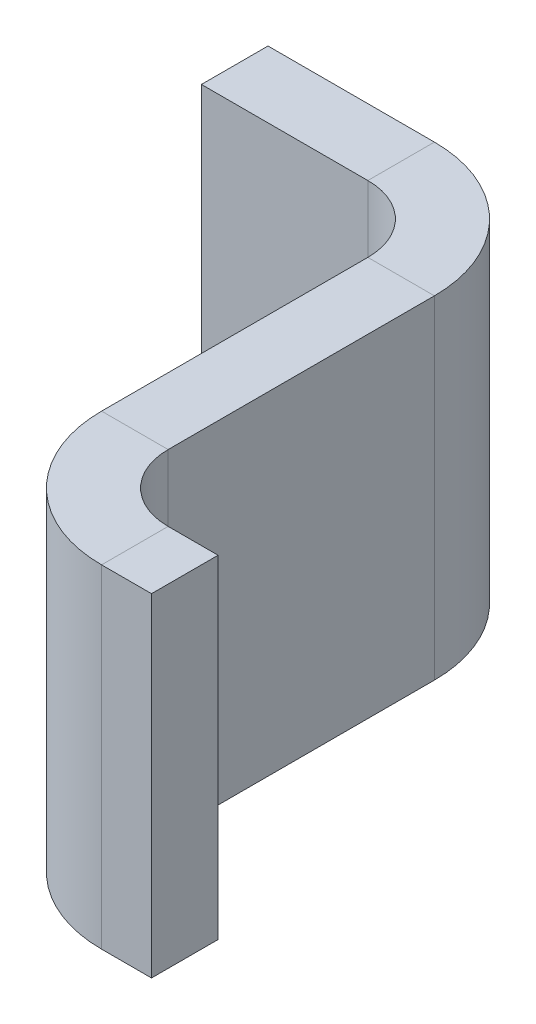
ISO-10303-21;
HEADER;
FILE_DESCRIPTION(('STEP AP214'),'2;1');
FILE_NAME('part.step','',(''),(''),'','','');
FILE_SCHEMA(('AUTOMOTIVE_DESIGN { 1 0 10303 214 1 1 1 1 }'));
ENDSEC;
DATA;
#1=APPLICATION_CONTEXT('core data for automotive mechanical design processes');
#2=APPLICATION_PROTOCOL_DEFINITION('international standard','automotive_design',2000,#1);
#3=PRODUCT_CONTEXT('',#1,'mechanical');
#4=PRODUCT('Part','Part','',(#3));
#5=PRODUCT_RELATED_PRODUCT_CATEGORY('part','',(#4));
#6=PRODUCT_DEFINITION_FORMATION('','',#4);
#7=PRODUCT_DEFINITION_CONTEXT('part definition',#1,'design');
#8=PRODUCT_DEFINITION('design','',#6,#7);
#9=PRODUCT_DEFINITION_SHAPE('','',#8);
#10=(LENGTH_UNIT() NAMED_UNIT(*) SI_UNIT(.MILLI.,.METRE.));
#11=(NAMED_UNIT(*) PLANE_ANGLE_UNIT() SI_UNIT($,.RADIAN.));
#12=(NAMED_UNIT(*) SI_UNIT($,.STERADIAN.) SOLID_ANGLE_UNIT());
#13=UNCERTAINTY_MEASURE_WITH_UNIT(LENGTH_MEASURE(1.E-05),#10,'distance_accuracy_value','');
#14=(GEOMETRIC_REPRESENTATION_CONTEXT(3) GLOBAL_UNCERTAINTY_ASSIGNED_CONTEXT((#13)) GLOBAL_UNIT_ASSIGNED_CONTEXT((#10,
#11,#12)) REPRESENTATION_CONTEXT('',''));
#15=CARTESIAN_POINT('',(0.,0.,0.));
#16=DIRECTION('',(0.,0.,1.));
#17=DIRECTION('',(1.,0.,0.));
#18=AXIS2_PLACEMENT_3D('',#15,#16,#17);
#19=CARTESIAN_POINT('',(125.54658584643,15.675655455272,0.));
#20=DIRECTION('',(1.,8.74227765734797E-08,0.));
#21=DIRECTION('',(0.,0.,-1.));
#22=AXIS2_PLACEMENT_3D('',#19,#20,#21);
#23=PLANE('',#22);
#24=DIRECTION('',(-8.74227765734797E-08,1.,0.));
#25=VECTOR('',#24,1.);
#26=CARTESIAN_POINT('',(125.54658584643,15.675655455272,0.));
#27=LINE('',#26,#25);
#28=CARTESIAN_POINT('',(125.54658589014,15.175655455272,0.));
#29=VERTEX_POINT('',#28);
#30=CARTESIAN_POINT('',(125.54658584643,15.675655455272,0.));
#31=VERTEX_POINT('',#30);
#32=EDGE_CURVE('E229',#29,#31,#27,.T.);
#33=ORIENTED_EDGE('',*,*,#32,.F.);
#34=DIRECTION('',(0.,0.,-1.));
#35=VECTOR('',#34,1.);
#36=CARTESIAN_POINT('',(125.54658589014,15.175655455272,0.));
#37=LINE('',#36,#35);
#38=CARTESIAN_POINT('',(125.54658589014,15.175655455272,0.1));
#39=VERTEX_POINT('',#38);
#40=EDGE_CURVE('E11',#39,#29,#37,.T.);
#41=ORIENTED_EDGE('',*,*,#40,.F.);
#42=DIRECTION('',(8.74227765734797E-08,-1.,0.));
#43=VECTOR('',#42,1.);
#44=CARTESIAN_POINT('',(125.54658589014,15.175655455272,0.1));
#45=LINE('',#44,#43);
#46=CARTESIAN_POINT('',(125.54658584643,15.675655455272,0.1));
#47=VERTEX_POINT('',#46);
#48=EDGE_CURVE('E132',#47,#39,#45,.T.);
#49=ORIENTED_EDGE('',*,*,#48,.F.);
#50=DIRECTION('',(0.,0.,1.));
#51=VECTOR('',#50,1.);
#52=CARTESIAN_POINT('',(125.54658584643,15.675655455272,0.1));
#53=LINE('',#52,#51);
#54=EDGE_CURVE('E224',#31,#47,#53,.T.);
#55=ORIENTED_EDGE('',*,*,#54,.F.);
#56=EDGE_LOOP('',(#33,#41,#49,#55));
#57=FACE_BOUND('',#56,.T.);
#58=ADVANCED_FACE('F16',(#57),#23,.F.);
#59=CARTESIAN_POINT('',(125.79658589014,15.175655477128,0.));
#60=DIRECTION('',(-8.74227765734797E-08,1.,0.));
#61=DIRECTION('',(0.,0.,1.));
#62=AXIS2_PLACEMENT_3D('',#59,#60,#61);
#63=PLANE('',#62);
#64=ORIENTED_EDGE('',*,*,#40,.T.);
#65=DIRECTION('',(-1.,-8.74227765734797E-08,0.));
#66=VECTOR('',#65,1.);
#67=CARTESIAN_POINT('',(125.79658589014,15.175655477128,0.));
#68=LINE('',#67,#66);
#69=CARTESIAN_POINT('',(125.79658589014,15.175655477128,0.));
#70=VERTEX_POINT('',#69);
#71=EDGE_CURVE('E210',#70,#29,#68,.T.);
#72=ORIENTED_EDGE('',*,*,#71,.F.);
#73=DIRECTION('',(0.,0.,-1.));
#74=VECTOR('',#73,1.);
#75=CARTESIAN_POINT('',(125.79658589014,15.175655477128,0.));
#76=LINE('',#75,#74);
#77=CARTESIAN_POINT('',(125.79658589014,15.175655477128,0.1));
#78=VERTEX_POINT('',#77);
#79=EDGE_CURVE('E27',#78,#70,#76,.T.);
#80=ORIENTED_EDGE('',*,*,#79,.F.);
#81=DIRECTION('',(-1.,-8.74227765734797E-08,0.));
#82=VECTOR('',#81,1.);
#83=CARTESIAN_POINT('',(125.79658589014,15.175655477128,0.1));
#84=LINE('',#83,#82);
#85=EDGE_CURVE('E169',#78,#39,#84,.T.);
#86=ORIENTED_EDGE('',*,*,#85,.T.);
#87=EDGE_LOOP('',(#64,#72,#80,#86));
#88=FACE_BOUND('',#87,.T.);
#89=ADVANCED_FACE('F292',(#88),#63,.F.);
#90=CARTESIAN_POINT('',(125.90265190732,15.1756554864,0.09393398282202));
#91=DIRECTION('',(8.74227765734797E-08,-1.,0.));
#92=DIRECTION('',(0.,0.,-1.));
#93=AXIS2_PLACEMENT_3D('',#90,#91,#92);
#94=PLANE('',#93);
#95=CARTESIAN_POINT('',(125.79658589014,15.175655477128,0.2));
#96=DIRECTION('',(-8.74227765734797E-08,1.,0.));
#97=DIRECTION('',(0.,0.,-1.));
#98=AXIS2_PLACEMENT_3D('',#95,#96,#97);
#99=CIRCLE('',#98,0.1);
#100=CARTESIAN_POINT('',(125.89658589014,15.17565548587,0.2));
#101=VERTEX_POINT('',#100);
#102=EDGE_CURVE('E111',#101,#78,#99,.T.);
#103=ORIENTED_EDGE('',*,*,#102,.T.);
#104=ORIENTED_EDGE('',*,*,#79,.T.);
#105=CARTESIAN_POINT('',(125.79658589014,15.175655477128,0.2));
#106=DIRECTION('',(-8.74227765734797E-08,1.,0.));
#107=DIRECTION('',(0.,0.,-1.));
#108=AXIS2_PLACEMENT_3D('',#105,#106,#107);
#109=CIRCLE('',#108,0.2);
#110=CARTESIAN_POINT('',(125.99658589014,15.175655494612,0.2));
#111=VERTEX_POINT('',#110);
#112=EDGE_CURVE('E114',#111,#70,#109,.T.);
#113=ORIENTED_EDGE('',*,*,#112,.F.);
#114=DIRECTION('',(1.,8.74227765734797E-08,0.));
#115=VECTOR('',#114,1.);
#116=CARTESIAN_POINT('',(125.99658589014,15.175655494612,0.2));
#117=LINE('',#116,#115);
#118=EDGE_CURVE('E108',#101,#111,#117,.T.);
#119=ORIENTED_EDGE('',*,*,#118,.F.);
#120=EDGE_LOOP('',(#103,#104,#113,#119));
#121=FACE_BOUND('',#120,.T.);
#122=ADVANCED_FACE('F110',(#121),#94,.T.);
#123=CARTESIAN_POINT('',(125.99658589014,15.175655494612,0.6));
#124=DIRECTION('',(-8.74227765734797E-08,1.,0.));
#125=DIRECTION('',(0.,0.,1.));
#126=AXIS2_PLACEMENT_3D('',#123,#124,#125);
#127=PLANE('',#126);
#128=ORIENTED_EDGE('',*,*,#118,.T.);
#129=DIRECTION('',(0.,0.,-1.));
#130=VECTOR('',#129,1.);
#131=CARTESIAN_POINT('',(125.99658589014,15.175655494612,0.6));
#132=LINE('',#131,#130);
#133=CARTESIAN_POINT('',(125.99658589014,15.175655494612,0.6));
#134=VERTEX_POINT('',#133);
#135=EDGE_CURVE('E156',#134,#111,#132,.T.);
#136=ORIENTED_EDGE('',*,*,#135,.F.);
#137=DIRECTION('',(1.,8.74227765734797E-08,0.));
#138=VECTOR('',#137,1.);
#139=CARTESIAN_POINT('',(125.99658589014,15.175655494612,0.6));
#140=LINE('',#139,#138);
#141=CARTESIAN_POINT('',(125.89658589014,15.17565548587,0.6));
#142=VERTEX_POINT('',#141);
#143=EDGE_CURVE('E120',#142,#134,#140,.T.);
#144=ORIENTED_EDGE('',*,*,#143,.F.);
#145=DIRECTION('',(0.,0.,-1.));
#146=VECTOR('',#145,1.);
#147=CARTESIAN_POINT('',(125.89658589014,15.17565548587,0.6));
#148=LINE('',#147,#146);
#149=EDGE_CURVE('E135',#142,#101,#148,.T.);
#150=ORIENTED_EDGE('',*,*,#149,.T.);
#151=EDGE_LOOP('',(#128,#136,#144,#150));
#152=FACE_BOUND('',#151,.T.);
#153=ADVANCED_FACE('F136',(#152),#127,.F.);
#154=CARTESIAN_POINT('',(125.99051987296,15.175655494082,0.706066017178));
#155=DIRECTION('',(8.74227765734797E-08,-1.,0.));
#156=DIRECTION('',(0.,0.,-1.));
#157=AXIS2_PLACEMENT_3D('',#154,#155,#156);
#158=PLANE('',#157);
#159=CARTESIAN_POINT('',(126.09658589014,15.175655503355,0.6));
#160=DIRECTION('',(8.74227765734797E-08,-1.,0.));
#161=DIRECTION('',(0.,0.,-1.));
#162=AXIS2_PLACEMENT_3D('',#159,#160,#161);
#163=CIRCLE('',#162,0.2);
#164=CARTESIAN_POINT('',(126.09658589014,15.175655503355,0.8));
#165=VERTEX_POINT('',#164);
#166=EDGE_CURVE('E147',#165,#142,#163,.T.);
#167=ORIENTED_EDGE('',*,*,#166,.T.);
#168=ORIENTED_EDGE('',*,*,#143,.T.);
#169=CARTESIAN_POINT('',(126.09658589014,15.175655503355,0.6));
#170=DIRECTION('',(8.74227765734797E-08,-1.,0.));
#171=DIRECTION('',(0.,0.,-1.));
#172=AXIS2_PLACEMENT_3D('',#169,#170,#171);
#173=CIRCLE('',#172,0.1);
#174=CARTESIAN_POINT('',(126.09658589014,15.175655503355,0.7));
#175=VERTEX_POINT('',#174);
#176=EDGE_CURVE('E206',#175,#134,#173,.T.);
#177=ORIENTED_EDGE('',*,*,#176,.F.);
#178=DIRECTION('',(0.,0.,-1.));
#179=VECTOR('',#178,1.);
#180=CARTESIAN_POINT('',(126.09658589014,15.175655503355,0.7));
#181=LINE('',#180,#179);
#182=EDGE_CURVE('E166',#165,#175,#181,.T.);
#183=ORIENTED_EDGE('',*,*,#182,.F.);
#184=EDGE_LOOP('',(#167,#168,#177,#183));
#185=FACE_BOUND('',#184,.T.);
#186=ADVANCED_FACE('F310',(#185),#158,.T.);
#187=CARTESIAN_POINT('',(126.17158589014,15.175655509911,0.7));
#188=DIRECTION('',(-8.74227765734797E-08,1.,0.));
#189=DIRECTION('',(0.,0.,1.));
#190=AXIS2_PLACEMENT_3D('',#187,#188,#189);
#191=PLANE('',#190);
#192=ORIENTED_EDGE('',*,*,#182,.T.);
#193=DIRECTION('',(-1.,-8.74227765734797E-08,0.));
#194=VECTOR('',#193,1.);
#195=CARTESIAN_POINT('',(126.17158589014,15.175655509911,0.7));
#196=LINE('',#195,#194);
#197=CARTESIAN_POINT('',(126.17158589014,15.175655509911,0.7));
#198=VERTEX_POINT('',#197);
#199=EDGE_CURVE('E187',#198,#175,#196,.T.);
#200=ORIENTED_EDGE('',*,*,#199,.F.);
#201=DIRECTION('',(0.,0.,-1.));
#202=VECTOR('',#201,1.);
#203=CARTESIAN_POINT('',(126.17158589014,15.175655509911,0.7));
#204=LINE('',#203,#202);
#205=CARTESIAN_POINT('',(126.17158589014,15.175655509911,0.8));
#206=VERTEX_POINT('',#205);
#207=EDGE_CURVE('E175',#206,#198,#204,.T.);
#208=ORIENTED_EDGE('',*,*,#207,.F.);
#209=DIRECTION('',(-1.,-8.74227765734797E-08,0.));
#210=VECTOR('',#209,1.);
#211=CARTESIAN_POINT('',(126.17158589014,15.175655509911,0.8));
#212=LINE('',#211,#210);
#213=EDGE_CURVE('E239',#206,#165,#212,.T.);
#214=ORIENTED_EDGE('',*,*,#213,.T.);
#215=EDGE_LOOP('',(#192,#200,#208,#214));
#216=FACE_BOUND('',#215,.T.);
#217=ADVANCED_FACE('F323',(#216),#191,.F.);
#218=CARTESIAN_POINT('',(125.79658589014,15.175655477128,0.1));
#219=DIRECTION('',(0.,0.,-1.));
#220=DIRECTION('',(0.,-1.,0.));
#221=AXIS2_PLACEMENT_3D('',#218,#219,#220);
#222=PLANE('',#221);
#223=ORIENTED_EDGE('',*,*,#48,.T.);
#224=ORIENTED_EDGE('',*,*,#85,.F.);
#225=DIRECTION('',(-8.74227765734797E-08,1.,0.));
#226=VECTOR('',#225,1.);
#227=CARTESIAN_POINT('',(125.79658589014,15.175655477128,0.1));
#228=LINE('',#227,#226);
#229=CARTESIAN_POINT('',(125.79658584643,15.675655477128,0.1));
#230=VERTEX_POINT('',#229);
#231=EDGE_CURVE('E130',#78,#230,#228,.T.);
#232=ORIENTED_EDGE('',*,*,#231,.T.);
#233=DIRECTION('',(-1.,-8.74227765734797E-08,0.));
#234=VECTOR('',#233,1.);
#235=CARTESIAN_POINT('',(125.79658584643,15.675655477128,0.1));
#236=LINE('',#235,#234);
#237=EDGE_CURVE('E240',#230,#47,#236,.T.);
#238=ORIENTED_EDGE('',*,*,#237,.T.);
#239=EDGE_LOOP('',(#223,#224,#232,#238));
#240=FACE_BOUND('',#239,.T.);
#241=ADVANCED_FACE('F498',(#240),#222,.F.);
#242=CARTESIAN_POINT('',(125.79658589014,15.175655477128,0.2));
#243=DIRECTION('',(-8.74227765734797E-08,1.,0.));
#244=DIRECTION('',(0.,0.,-1.));
#245=AXIS2_PLACEMENT_3D('',#242,#243,#244);
#246=CYLINDRICAL_SURFACE('',#245,0.1);
#247=ORIENTED_EDGE('',*,*,#231,.F.);
#248=ORIENTED_EDGE('',*,*,#102,.F.);
#249=DIRECTION('',(8.74227765734797E-08,-1.,0.));
#250=VECTOR('',#249,1.);
#251=CARTESIAN_POINT('',(125.89658589014,15.17565548587,0.2));
#252=LINE('',#251,#250);
#253=CARTESIAN_POINT('',(125.89658584643,15.67565548587,0.2));
#254=VERTEX_POINT('',#253);
#255=EDGE_CURVE('E127',#254,#101,#252,.T.);
#256=ORIENTED_EDGE('',*,*,#255,.F.);
#257=CARTESIAN_POINT('',(125.79658584643,15.675655477128,0.2));
#258=DIRECTION('',(-8.74227765734797E-08,1.,0.));
#259=DIRECTION('',(0.,0.,-1.));
#260=AXIS2_PLACEMENT_3D('',#257,#258,#259);
#261=CIRCLE('',#260,0.1);
#262=EDGE_CURVE('E181',#254,#230,#261,.T.);
#263=ORIENTED_EDGE('',*,*,#262,.T.);
#264=EDGE_LOOP('',(#247,#248,#256,#263));
#265=FACE_BOUND('',#264,.T.);
#266=ADVANCED_FACE('F124',(#265),#246,.F.);
#267=CARTESIAN_POINT('',(125.89658589014,15.17565548587,0.6));
#268=DIRECTION('',(1.,8.74227765734797E-08,0.));
#269=DIRECTION('',(0.,0.,-1.));
#270=AXIS2_PLACEMENT_3D('',#267,#268,#269);
#271=PLANE('',#270);
#272=ORIENTED_EDGE('',*,*,#255,.T.);
#273=ORIENTED_EDGE('',*,*,#149,.F.);
#274=DIRECTION('',(8.74227765734797E-08,-1.,0.));
#275=VECTOR('',#274,1.);
#276=CARTESIAN_POINT('',(125.89658589014,15.17565548587,0.6));
#277=LINE('',#276,#275);
#278=CARTESIAN_POINT('',(125.89658584643,15.67565548587,0.6));
#279=VERTEX_POINT('',#278);
#280=EDGE_CURVE('E153',#279,#142,#277,.T.);
#281=ORIENTED_EDGE('',*,*,#280,.F.);
#282=DIRECTION('',(0.,0.,-1.));
#283=VECTOR('',#282,1.);
#284=CARTESIAN_POINT('',(125.89658584643,15.67565548587,0.6));
#285=LINE('',#284,#283);
#286=EDGE_CURVE('E144',#279,#254,#285,.T.);
#287=ORIENTED_EDGE('',*,*,#286,.T.);
#288=EDGE_LOOP('',(#272,#273,#281,#287));
#289=FACE_BOUND('',#288,.T.);
#290=ADVANCED_FACE('F142',(#289),#271,.F.);
#291=CARTESIAN_POINT('',(126.09658589014,15.175655503355,0.6));
#292=DIRECTION('',(8.74227765734797E-08,-1.,0.));
#293=DIRECTION('',(0.,0.,-1.));
#294=AXIS2_PLACEMENT_3D('',#291,#292,#293);
#295=CYLINDRICAL_SURFACE('',#294,0.2);
#296=CARTESIAN_POINT('',(126.09658584643,15.675655503355,0.6));
#297=DIRECTION('',(8.74227765734797E-08,-1.,0.));
#298=DIRECTION('',(0.,0.,-1.));
#299=AXIS2_PLACEMENT_3D('',#296,#297,#298);
#300=CIRCLE('',#299,0.2);
#301=CARTESIAN_POINT('',(126.09658584643,15.675655503355,0.8));
#302=VERTEX_POINT('',#301);
#303=EDGE_CURVE('E214',#302,#279,#300,.T.);
#304=ORIENTED_EDGE('',*,*,#303,.T.);
#305=ORIENTED_EDGE('',*,*,#280,.T.);
#306=ORIENTED_EDGE('',*,*,#166,.F.);
#307=DIRECTION('',(8.74227765734797E-08,-1.,0.));
#308=VECTOR('',#307,1.);
#309=CARTESIAN_POINT('',(126.09658589014,15.175655503355,0.8));
#310=LINE('',#309,#308);
#311=EDGE_CURVE('E235',#302,#165,#310,.T.);
#312=ORIENTED_EDGE('',*,*,#311,.F.);
#313=EDGE_LOOP('',(#304,#305,#306,#312));
#314=FACE_BOUND('',#313,.T.);
#315=ADVANCED_FACE('F341',(#314),#295,.T.);
#316=CARTESIAN_POINT('',(126.17158589014,15.175655509911,0.8));
#317=DIRECTION('',(0.,0.,-1.));
#318=DIRECTION('',(0.,-1.,0.));
#319=AXIS2_PLACEMENT_3D('',#316,#317,#318);
#320=PLANE('',#319);
#321=ORIENTED_EDGE('',*,*,#311,.T.);
#322=ORIENTED_EDGE('',*,*,#213,.F.);
#323=DIRECTION('',(8.74227765734797E-08,-1.,0.));
#324=VECTOR('',#323,1.);
#325=CARTESIAN_POINT('',(126.17158589014,15.175655509911,0.8));
#326=LINE('',#325,#324);
#327=CARTESIAN_POINT('',(126.17158584643,15.675655509911,0.8));
#328=VERTEX_POINT('',#327);
#329=EDGE_CURVE('E171',#328,#206,#326,.T.);
#330=ORIENTED_EDGE('',*,*,#329,.F.);
#331=DIRECTION('',(-1.,-8.74227765734797E-08,0.));
#332=VECTOR('',#331,1.);
#333=CARTESIAN_POINT('',(126.17158584643,15.675655509911,0.8));
#334=LINE('',#333,#332);
#335=EDGE_CURVE('E160',#328,#302,#334,.T.);
#336=ORIENTED_EDGE('',*,*,#335,.T.);
#337=EDGE_LOOP('',(#321,#322,#330,#336));
#338=FACE_BOUND('',#337,.T.);
#339=ADVANCED_FACE('F18',(#338),#320,.F.);
#340=CARTESIAN_POINT('',(125.79658584643,15.675655477128,0.1));
#341=DIRECTION('',(8.74227765734797E-08,-1.,0.));
#342=DIRECTION('',(0.,0.,-1.));
#343=AXIS2_PLACEMENT_3D('',#340,#341,#342);
#344=PLANE('',#343);
#345=ORIENTED_EDGE('',*,*,#54,.T.);
#346=ORIENTED_EDGE('',*,*,#237,.F.);
#347=DIRECTION('',(0.,0.,1.));
#348=VECTOR('',#347,1.);
#349=CARTESIAN_POINT('',(125.79658584643,15.675655477128,0.1));
#350=LINE('',#349,#348);
#351=CARTESIAN_POINT('',(125.79658584643,15.675655477128,0.));
#352=VERTEX_POINT('',#351);
#353=EDGE_CURVE('E177',#352,#230,#350,.T.);
#354=ORIENTED_EDGE('',*,*,#353,.F.);
#355=DIRECTION('',(-1.,-8.74227765734797E-08,0.));
#356=VECTOR('',#355,1.);
#357=CARTESIAN_POINT('',(125.79658584643,15.675655477128,0.));
#358=LINE('',#357,#356);
#359=EDGE_CURVE('E233',#352,#31,#358,.T.);
#360=ORIENTED_EDGE('',*,*,#359,.T.);
#361=EDGE_LOOP('',(#345,#346,#354,#360));
#362=FACE_BOUND('',#361,.T.);
#363=ADVANCED_FACE('F481',(#362),#344,.F.);
#364=CARTESIAN_POINT('',(125.9026518636,15.6756554864,0.09393398282202));
#365=DIRECTION('',(-8.74227765734797E-08,1.,0.));
#366=DIRECTION('',(0.,0.,1.));
#367=AXIS2_PLACEMENT_3D('',#364,#365,#366);
#368=PLANE('',#367);
#369=CARTESIAN_POINT('',(125.79658584643,15.675655477128,0.2));
#370=DIRECTION('',(-8.74227765734797E-08,1.,0.));
#371=DIRECTION('',(0.,0.,-1.));
#372=AXIS2_PLACEMENT_3D('',#369,#370,#371);
#373=CIRCLE('',#372,0.2);
#374=CARTESIAN_POINT('',(125.99658584643,15.675655494612,0.2));
#375=VERTEX_POINT('',#374);
#376=EDGE_CURVE('E234',#375,#352,#373,.T.);
#377=ORIENTED_EDGE('',*,*,#376,.T.);
#378=ORIENTED_EDGE('',*,*,#353,.T.);
#379=ORIENTED_EDGE('',*,*,#262,.F.);
#380=DIRECTION('',(-1.,-8.74227765734797E-08,0.));
#381=VECTOR('',#380,1.);
#382=CARTESIAN_POINT('',(125.89658584643,15.67565548587,0.2));
#383=LINE('',#382,#381);
#384=EDGE_CURVE('E218',#375,#254,#383,.T.);
#385=ORIENTED_EDGE('',*,*,#384,.F.);
#386=EDGE_LOOP('',(#377,#378,#379,#385));
#387=FACE_BOUND('',#386,.T.);
#388=ADVANCED_FACE('F514',(#387),#368,.T.);
#389=CARTESIAN_POINT('',(125.89658584643,15.67565548587,0.6));
#390=DIRECTION('',(8.74227765734797E-08,-1.,0.));
#391=DIRECTION('',(0.,0.,-1.));
#392=AXIS2_PLACEMENT_3D('',#389,#390,#391);
#393=PLANE('',#392);
#394=ORIENTED_EDGE('',*,*,#384,.T.);
#395=ORIENTED_EDGE('',*,*,#286,.F.);
#396=DIRECTION('',(-1.,-8.74227765734797E-08,0.));
#397=VECTOR('',#396,1.);
#398=CARTESIAN_POINT('',(125.89658584643,15.67565548587,0.6));
#399=LINE('',#398,#397);
#400=CARTESIAN_POINT('',(125.99658584643,15.675655494612,0.6));
#401=VERTEX_POINT('',#400);
#402=EDGE_CURVE('E164',#401,#279,#399,.T.);
#403=ORIENTED_EDGE('',*,*,#402,.F.);
#404=DIRECTION('',(0.,0.,-1.));
#405=VECTOR('',#404,1.);
#406=CARTESIAN_POINT('',(125.99658584643,15.675655494612,0.6));
#407=LINE('',#406,#405);
#408=EDGE_CURVE('E159',#401,#375,#407,.T.);
#409=ORIENTED_EDGE('',*,*,#408,.T.);
#410=EDGE_LOOP('',(#394,#395,#403,#409));
#411=FACE_BOUND('',#410,.T.);
#412=ADVANCED_FACE('F518',(#411),#393,.F.);
#413=CARTESIAN_POINT('',(125.99051982925,15.675655494082,0.706066017178));
#414=DIRECTION('',(-8.74227765734797E-08,1.,0.));
#415=DIRECTION('',(0.,0.,1.));
#416=AXIS2_PLACEMENT_3D('',#413,#414,#415);
#417=PLANE('',#416);
#418=CARTESIAN_POINT('',(126.09658584643,15.675655503355,0.6));
#419=DIRECTION('',(8.74227765734797E-08,-1.,0.));
#420=DIRECTION('',(0.,0.,-1.));
#421=AXIS2_PLACEMENT_3D('',#418,#419,#420);
#422=CIRCLE('',#421,0.1);
#423=CARTESIAN_POINT('',(126.09658584643,15.675655503355,0.7));
#424=VERTEX_POINT('',#423);
#425=EDGE_CURVE('E186',#424,#401,#422,.T.);
#426=ORIENTED_EDGE('',*,*,#425,.T.);
#427=ORIENTED_EDGE('',*,*,#402,.T.);
#428=ORIENTED_EDGE('',*,*,#303,.F.);
#429=DIRECTION('',(0.,0.,1.));
#430=VECTOR('',#429,1.);
#431=CARTESIAN_POINT('',(126.09658584643,15.675655503355,0.8));
#432=LINE('',#431,#430);
#433=EDGE_CURVE('E165',#424,#302,#432,.T.);
#434=ORIENTED_EDGE('',*,*,#433,.F.);
#435=EDGE_LOOP('',(#426,#427,#428,#434));
#436=FACE_BOUND('',#435,.T.);
#437=ADVANCED_FACE('F344',(#436),#417,.T.);
#438=CARTESIAN_POINT('',(126.17158584643,15.675655509911,0.8));
#439=DIRECTION('',(8.74227765734797E-08,-1.,0.));
#440=DIRECTION('',(0.,0.,-1.));
#441=AXIS2_PLACEMENT_3D('',#438,#439,#440);
#442=PLANE('',#441);
#443=ORIENTED_EDGE('',*,*,#433,.T.);
#444=ORIENTED_EDGE('',*,*,#335,.F.);
#445=DIRECTION('',(0.,0.,1.));
#446=VECTOR('',#445,1.);
#447=CARTESIAN_POINT('',(126.17158584643,15.675655509911,0.8));
#448=LINE('',#447,#446);
#449=CARTESIAN_POINT('',(126.17158584643,15.675655509911,0.7));
#450=VERTEX_POINT('',#449);
#451=EDGE_CURVE('E176',#450,#328,#448,.T.);
#452=ORIENTED_EDGE('',*,*,#451,.F.);
#453=DIRECTION('',(-1.,-8.74227765734797E-08,0.));
#454=VECTOR('',#453,1.);
#455=CARTESIAN_POINT('',(126.17158584643,15.675655509911,0.7));
#456=LINE('',#455,#454);
#457=EDGE_CURVE('E195',#450,#424,#456,.T.);
#458=ORIENTED_EDGE('',*,*,#457,.T.);
#459=EDGE_LOOP('',(#443,#444,#452,#458));
#460=FACE_BOUND('',#459,.T.);
#461=ADVANCED_FACE('F349',(#460),#442,.F.);
#462=CARTESIAN_POINT('',(125.79658584643,15.675655477128,0.));
#463=DIRECTION('',(0.,0.,1.));
#464=DIRECTION('',(1.,0.,0.));
#465=AXIS2_PLACEMENT_3D('',#462,#463,#464);
#466=PLANE('',#465);
#467=ORIENTED_EDGE('',*,*,#32,.T.);
#468=ORIENTED_EDGE('',*,*,#359,.F.);
#469=DIRECTION('',(-8.74227765734797E-08,1.,0.));
#470=VECTOR('',#469,1.);
#471=CARTESIAN_POINT('',(125.79658584643,15.675655477128,0.));
#472=LINE('',#471,#470);
#473=EDGE_CURVE('E197',#70,#352,#472,.T.);
#474=ORIENTED_EDGE('',*,*,#473,.F.);
#475=ORIENTED_EDGE('',*,*,#71,.T.);
#476=EDGE_LOOP('',(#467,#468,#474,#475));
#477=FACE_BOUND('',#476,.T.);
#478=ADVANCED_FACE('F295',(#477),#466,.F.);
#479=CARTESIAN_POINT('',(125.79658584643,15.675655477128,0.2));
#480=DIRECTION('',(-8.74227765734797E-08,1.,0.));
#481=DIRECTION('',(0.,0.,-1.));
#482=AXIS2_PLACEMENT_3D('',#479,#480,#481);
#483=CYLINDRICAL_SURFACE('',#482,0.2);
#484=ORIENTED_EDGE('',*,*,#112,.T.);
#485=ORIENTED_EDGE('',*,*,#473,.T.);
#486=ORIENTED_EDGE('',*,*,#376,.F.);
#487=DIRECTION('',(-8.74227765734797E-08,1.,0.));
#488=VECTOR('',#487,1.);
#489=CARTESIAN_POINT('',(125.99658584643,15.675655494612,0.2));
#490=LINE('',#489,#488);
#491=EDGE_CURVE('E202',#111,#375,#490,.T.);
#492=ORIENTED_EDGE('',*,*,#491,.F.);
#493=EDGE_LOOP('',(#484,#485,#486,#492));
#494=FACE_BOUND('',#493,.T.);
#495=ADVANCED_FACE('F299',(#494),#483,.T.);
#496=CARTESIAN_POINT('',(125.99658584643,15.675655494612,0.6));
#497=DIRECTION('',(-1.,-8.74227765734797E-08,0.));
#498=DIRECTION('',(-8.74227765734797E-08,1.,0.));
#499=AXIS2_PLACEMENT_3D('',#496,#497,#498);
#500=PLANE('',#499);
#501=ORIENTED_EDGE('',*,*,#491,.T.);
#502=ORIENTED_EDGE('',*,*,#408,.F.);
#503=DIRECTION('',(8.74227765734797E-08,-1.,0.));
#504=VECTOR('',#503,1.);
#505=CARTESIAN_POINT('',(125.99658584643,15.675655494612,0.6));
#506=LINE('',#505,#504);
#507=EDGE_CURVE('E182',#401,#134,#506,.T.);
#508=ORIENTED_EDGE('',*,*,#507,.T.);
#509=ORIENTED_EDGE('',*,*,#135,.T.);
#510=EDGE_LOOP('',(#501,#502,#508,#509));
#511=FACE_BOUND('',#510,.T.);
#512=ADVANCED_FACE('F302',(#511),#500,.F.);
#513=CARTESIAN_POINT('',(126.09658584643,15.675655503355,0.6));
#514=DIRECTION('',(8.74227765734797E-08,-1.,0.));
#515=DIRECTION('',(0.,0.,-1.));
#516=AXIS2_PLACEMENT_3D('',#513,#514,#515);
#517=CYLINDRICAL_SURFACE('',#516,0.1);
#518=ORIENTED_EDGE('',*,*,#507,.F.);
#519=ORIENTED_EDGE('',*,*,#425,.F.);
#520=DIRECTION('',(-8.74227765734797E-08,1.,0.));
#521=VECTOR('',#520,1.);
#522=CARTESIAN_POINT('',(126.09658584643,15.675655503355,0.7));
#523=LINE('',#522,#521);
#524=EDGE_CURVE('E191',#175,#424,#523,.T.);
#525=ORIENTED_EDGE('',*,*,#524,.F.);
#526=ORIENTED_EDGE('',*,*,#176,.T.);
#527=EDGE_LOOP('',(#518,#519,#525,#526));
#528=FACE_BOUND('',#527,.T.);
#529=ADVANCED_FACE('F307',(#528),#517,.F.);
#530=CARTESIAN_POINT('',(126.17158584643,15.675655509911,0.7));
#531=DIRECTION('',(0.,0.,1.));
#532=DIRECTION('',(1.,0.,0.));
#533=AXIS2_PLACEMENT_3D('',#530,#531,#532);
#534=PLANE('',#533);
#535=ORIENTED_EDGE('',*,*,#524,.T.);
#536=ORIENTED_EDGE('',*,*,#457,.F.);
#537=DIRECTION('',(-8.74227765734797E-08,1.,0.));
#538=VECTOR('',#537,1.);
#539=CARTESIAN_POINT('',(126.17158584643,15.675655509911,0.7));
#540=LINE('',#539,#538);
#541=EDGE_CURVE('E20',#198,#450,#540,.T.);
#542=ORIENTED_EDGE('',*,*,#541,.F.);
#543=ORIENTED_EDGE('',*,*,#199,.T.);
#544=EDGE_LOOP('',(#535,#536,#542,#543));
#545=FACE_BOUND('',#544,.T.);
#546=ADVANCED_FACE('F318',(#545),#534,.F.);
#547=CARTESIAN_POINT('',(126.17158584643,15.675655509911,0.7));
#548=DIRECTION('',(1.,8.74227765734797E-08,0.));
#549=DIRECTION('',(0.,0.,-1.));
#550=AXIS2_PLACEMENT_3D('',#547,#548,#549);
#551=PLANE('',#550);
#552=ORIENTED_EDGE('',*,*,#451,.T.);
#553=ORIENTED_EDGE('',*,*,#329,.T.);
#554=ORIENTED_EDGE('',*,*,#207,.T.);
#555=ORIENTED_EDGE('',*,*,#541,.T.);
#556=EDGE_LOOP('',(#552,#553,#554,#555));
#557=FACE_BOUND('',#556,.T.);
#558=ADVANCED_FACE('F351',(#557),#551,.T.);
#559=CLOSED_SHELL('',(#58,#89,#122,#153,#186,#217,#241,#266,#290,#315,#339,#363,#388,#412,#437,
#461,#478,#495,#512,#529,#546,#558));
#560=MANIFOLD_SOLID_BREP('B1',#559);
#561=ADVANCED_BREP_SHAPE_REPRESENTATION('',(#18,#560),#14);
#562=SHAPE_DEFINITION_REPRESENTATION(#9,#561);
ENDSEC;
END-ISO-10303-21;
